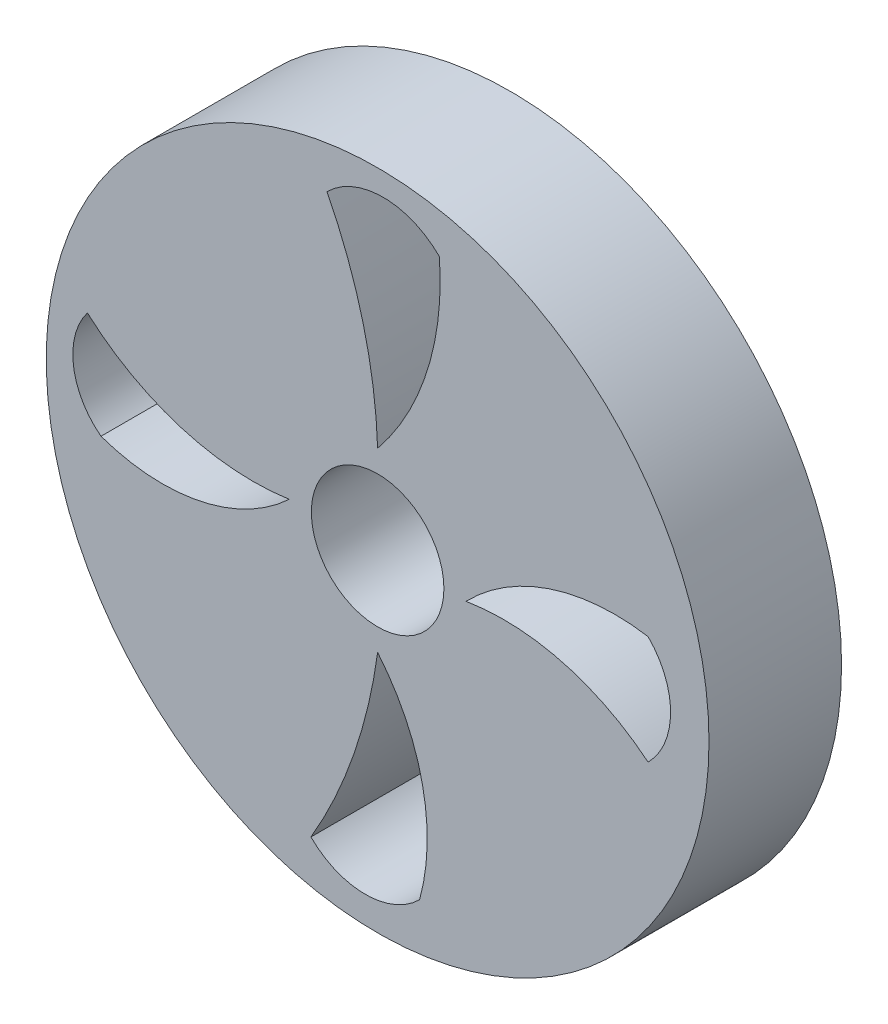
ISO-10303-21;
HEADER;
FILE_DESCRIPTION(('STEP AP214'),'2;1');
FILE_NAME('part.step','',(''),(''),'','','');
FILE_SCHEMA(('AUTOMOTIVE_DESIGN { 1 0 10303 214 1 1 1 1 }'));
ENDSEC;
DATA;
#1=APPLICATION_CONTEXT('core data for automotive mechanical design processes');
#2=APPLICATION_PROTOCOL_DEFINITION('international standard','automotive_design',2000,#1);
#3=PRODUCT_CONTEXT('',#1,'mechanical');
#4=PRODUCT('Part','Part','',(#3));
#5=PRODUCT_RELATED_PRODUCT_CATEGORY('part','',(#4));
#6=PRODUCT_DEFINITION_FORMATION('','',#4);
#7=PRODUCT_DEFINITION_CONTEXT('part definition',#1,'design');
#8=PRODUCT_DEFINITION('design','',#6,#7);
#9=PRODUCT_DEFINITION_SHAPE('','',#8);
#10=(LENGTH_UNIT() NAMED_UNIT(*) SI_UNIT(.MILLI.,.METRE.));
#11=(NAMED_UNIT(*) PLANE_ANGLE_UNIT() SI_UNIT($,.RADIAN.));
#12=(NAMED_UNIT(*) SI_UNIT($,.STERADIAN.) SOLID_ANGLE_UNIT());
#13=UNCERTAINTY_MEASURE_WITH_UNIT(LENGTH_MEASURE(1.E-05),#10,'distance_accuracy_value','');
#14=(GEOMETRIC_REPRESENTATION_CONTEXT(3) GLOBAL_UNCERTAINTY_ASSIGNED_CONTEXT((#13)) GLOBAL_UNIT_ASSIGNED_CONTEXT((#10,
#11,#12)) REPRESENTATION_CONTEXT('',''));
#15=CARTESIAN_POINT('',(0.,0.,0.));
#16=DIRECTION('',(0.,0.,1.));
#17=DIRECTION('',(1.,0.,0.));
#18=AXIS2_PLACEMENT_3D('',#15,#16,#17);
#19=CARTESIAN_POINT('',(0.,0.,30.));
#20=DIRECTION('',(0.,0.,1.));
#21=DIRECTION('',(1.,0.,0.));
#22=AXIS2_PLACEMENT_3D('',#19,#20,#21);
#23=PLANE('',#22);
#24=CARTESIAN_POINT('',(-106.126669455421,16.4687254610501,30.));
#25=DIRECTION('',(0.,0.,-1.));
#26=DIRECTION('',(1.,0.,0.));
#27=AXIS2_PLACEMENT_3D('',#24,#25,#26);
#28=CIRCLE('',#27,106.185403279215);
#29=CARTESIAN_POINT('',(-11.4602468320541,64.5687077610854,30.));
#30=VERTEX_POINT('',#29);
#31=CARTESIAN_POINT('',(0.,20.,30.));
#32=VERTEX_POINT('',#31);
#33=EDGE_CURVE('E51',#30,#32,#28,.T.);
#34=ORIENTED_EDGE('',*,*,#33,.F.);
#35=CARTESIAN_POINT('',(1.25783196937179,51.8506289596594,30.));
#36=DIRECTION('',(0.,0.,1.));
#37=DIRECTION('',(-1.,0.,0.));
#38=AXIS2_PLACEMENT_3D('',#35,#36,#37);
#39=CIRCLE('',#38,17.9860795283063);
#40=CARTESIAN_POINT('',(13.9759107707977,64.5687077610854,30.));
#41=VERTEX_POINT('',#40);
#42=EDGE_CURVE('E143',#41,#30,#39,.T.);
#43=ORIENTED_EDGE('',*,*,#42,.F.);
#44=CARTESIAN_POINT('',(-48.9227364039404,59.8168980990145,30.));
#45=DIRECTION('',(0.,0.,1.));
#46=DIRECTION('',(1.,0.,0.));
#47=AXIS2_PLACEMENT_3D('',#44,#45,#46);
#48=CIRCLE('',#47,63.0778844879625);
#49=EDGE_CURVE('E146',#32,#41,#48,.T.);
#50=ORIENTED_EDGE('',*,*,#49,.F.);
#51=EDGE_LOOP('',(#34,#43,#50));
#52=FACE_BOUND('',#51,.T.);
#53=CARTESIAN_POINT('',(-28.187497756684,55.7355617112716,30.));
#54=DIRECTION('',(0.,0.,-1.));
#55=DIRECTION('',(-1.,0.,0.));
#56=AXIS2_PLACEMENT_3D('',#53,#54,#55);
#57=CIRCLE('',#56,56.3337195539818);
#58=CARTESIAN_POINT('',(-20.,0.,30.));
#59=VERTEX_POINT('',#58);
#60=CARTESIAN_POINT('',(-65.6867806227491,13.6963925553818,30.));
#61=VERTEX_POINT('',#60);
#62=EDGE_CURVE('E59',#59,#61,#57,.T.);
#63=ORIENTED_EDGE('',*,*,#62,.F.);
#64=CARTESIAN_POINT('',(-48.6879422626072,30.6951624182342,30.));
#65=DIRECTION('',(0.,0.,1.));
#66=DIRECTION('',(-1.,0.,0.));
#67=AXIS2_PLACEMENT_3D('',#64,#65,#66);
#68=CIRCLE('',#67,42.0141765020387);
#69=CARTESIAN_POINT('',(-62.6120802531736,-8.94458289331041,30.));
#70=VERTEX_POINT('',#69);
#71=EDGE_CURVE('E164',#70,#59,#68,.T.);
#72=ORIENTED_EDGE('',*,*,#71,.F.);
#73=CARTESIAN_POINT('',(-52.8289427136153,3.91325501582344,30.));
#74=DIRECTION('',(0.,0.,1.));
#75=DIRECTION('',(1.,0.,0.));
#76=AXIS2_PLACEMENT_3D('',#73,#74,#75);
#77=CIRCLE('',#76,16.1565397228328);
#78=EDGE_CURVE('E167',#61,#70,#77,.T.);
#79=ORIENTED_EDGE('',*,*,#78,.F.);
#80=EDGE_LOOP('',(#63,#72,#79));
#81=FACE_BOUND('',#80,.T.);
#82=CARTESIAN_POINT('',(53.7070275288195,-32.5710055331906,30.));
#83=DIRECTION('',(0.,0.,1.));
#84=DIRECTION('',(-1.,0.,0.));
#85=AXIS2_PLACEMENT_3D('',#82,#83,#84);
#86=CIRCLE('',#85,46.8725304018434);
#87=CARTESIAN_POINT('',(61.2144891760938,13.6963925553818,30.));
#88=VERTEX_POINT('',#87);
#89=CARTESIAN_POINT('',(20.,0.,30.));
#90=VERTEX_POINT('',#89);
#91=EDGE_CURVE('E163',#88,#90,#86,.T.);
#92=ORIENTED_EDGE('',*,*,#91,.F.);
#93=CARTESIAN_POINT('',(48.9156876977919,1.39759107707988,30.));
#94=DIRECTION('',(0.,0.,1.));
#95=DIRECTION('',(-1.,0.,0.));
#96=AXIS2_PLACEMENT_3D('',#93,#94,#95);
#97=CIRCLE('',#96,17.3931318515489);
#98=CARTESIAN_POINT('',(61.2144891760938,-10.9012104012221,30.));
#99=VERTEX_POINT('',#98);
#100=EDGE_CURVE('E188',#99,#88,#97,.T.);
#101=ORIENTED_EDGE('',*,*,#100,.F.);
#102=CARTESIAN_POINT('',(28.5654745935392,-50.9772376417217,30.));
#103=DIRECTION('',(0.,0.,-1.));
#104=DIRECTION('',(-1.,0.,0.));
#105=AXIS2_PLACEMENT_3D('',#102,#103,#104);
#106=CIRCLE('',#105,51.6918379688044);
#107=EDGE_CURVE('E191',#90,#99,#106,.T.);
#108=ORIENTED_EDGE('',*,*,#107,.F.);
#109=EDGE_LOOP('',(#92,#101,#108));
#110=FACE_BOUND('',#109,.T.);
#111=CARTESIAN_POINT('',(-116.539732142312,-4.24493298694466,30.));
#112=DIRECTION('',(0.,0.,-1.));
#113=DIRECTION('',(-1.,0.,0.));
#114=AXIS2_PLACEMENT_3D('',#111,#112,#113);
#115=CIRCLE('',#114,117.599877994782);
#116=CARTESIAN_POINT('',(0.,-20.,30.));
#117=VERTEX_POINT('',#116);
#118=CARTESIAN_POINT('',(-15.0939836324615,-63.7301531148373,30.));
#119=VERTEX_POINT('',#118);
#120=EDGE_CURVE('E187',#117,#119,#115,.T.);
#121=ORIENTED_EDGE('',*,*,#120,.F.);
#122=CARTESIAN_POINT('',(-37.074652396603,-50.9549777987307,30.));
#123=DIRECTION('',(0.,0.,1.));
#124=DIRECTION('',(-1.,0.,0.));
#125=AXIS2_PLACEMENT_3D('',#122,#123,#124);
#126=CIRCLE('',#125,48.2984523649449);
#127=CARTESIAN_POINT('',(9.50361932414243,-63.7301531148373,30.));
#128=VERTEX_POINT('',#127);
#129=EDGE_CURVE('E211',#128,#117,#126,.T.);
#130=ORIENTED_EDGE('',*,*,#129,.F.);
#131=CARTESIAN_POINT('',(-2.79518215415954,-51.4313516365353,30.));
#132=DIRECTION('',(0.,0.,1.));
#133=DIRECTION('',(1.,0.,0.));
#134=AXIS2_PLACEMENT_3D('',#131,#132,#133);
#135=CIRCLE('',#134,17.3931318515489);
#136=EDGE_CURVE('E214',#119,#128,#135,.T.);
#137=ORIENTED_EDGE('',*,*,#136,.F.);
#138=EDGE_LOOP('',(#121,#130,#137));
#139=FACE_BOUND('',#138,.T.);
#140=CARTESIAN_POINT('',(0.,0.,30.));
#141=DIRECTION('',(0.,0.,1.));
#142=DIRECTION('',(1.,0.,0.));
#143=AXIS2_PLACEMENT_3D('',#140,#141,#142);
#144=CIRCLE('',#143,75.);
#145=CARTESIAN_POINT('',(75.,0.,30.));
#146=VERTEX_POINT('',#145);
#147=EDGE_CURVE('E11',#146,#146,#144,.T.);
#148=ORIENTED_EDGE('',*,*,#147,.T.);
#149=EDGE_LOOP('',(#148));
#150=FACE_BOUND('',#149,.T.);
#151=CARTESIAN_POINT('',(0.,0.,30.));
#152=DIRECTION('',(0.,0.,1.));
#153=DIRECTION('',(1.,0.,0.));
#154=AXIS2_PLACEMENT_3D('',#151,#152,#153);
#155=CIRCLE('',#154,15.);
#156=CARTESIAN_POINT('',(15.,0.,30.));
#157=VERTEX_POINT('',#156);
#158=EDGE_CURVE('E226',#157,#157,#155,.T.);
#159=ORIENTED_EDGE('',*,*,#158,.F.);
#160=EDGE_LOOP('',(#159));
#161=FACE_BOUND('',#160,.T.);
#162=ADVANCED_FACE('F36',(#52,#81,#110,#139,#150,#161),#23,.T.);
#163=CARTESIAN_POINT('',(0.,0.,0.));
#164=DIRECTION('',(0.,0.,1.));
#165=DIRECTION('',(1.,0.,0.));
#166=AXIS2_PLACEMENT_3D('',#163,#164,#165);
#167=PLANE('',#166);
#168=CARTESIAN_POINT('',(1.25783196937179,51.8506289596594,0.));
#169=DIRECTION('',(0.,0.,1.));
#170=DIRECTION('',(-1.,0.,0.));
#171=AXIS2_PLACEMENT_3D('',#168,#169,#170);
#172=CIRCLE('',#171,17.9860795283063);
#173=CARTESIAN_POINT('',(13.9759107707977,64.5687077610854,0.));
#174=VERTEX_POINT('',#173);
#175=CARTESIAN_POINT('',(-11.4602468320541,64.5687077610854,0.));
#176=VERTEX_POINT('',#175);
#177=EDGE_CURVE('E133',#174,#176,#172,.T.);
#178=ORIENTED_EDGE('',*,*,#177,.T.);
#179=CARTESIAN_POINT('',(-106.126669455421,16.4687254610501,0.));
#180=DIRECTION('',(0.,0.,-1.));
#181=DIRECTION('',(1.,0.,0.));
#182=AXIS2_PLACEMENT_3D('',#179,#180,#181);
#183=CIRCLE('',#182,106.185403279215);
#184=CARTESIAN_POINT('',(0.,20.,0.));
#185=VERTEX_POINT('',#184);
#186=EDGE_CURVE('E127',#176,#185,#183,.T.);
#187=ORIENTED_EDGE('',*,*,#186,.T.);
#188=CARTESIAN_POINT('',(-48.9227364039404,59.8168980990145,0.));
#189=DIRECTION('',(0.,0.,1.));
#190=DIRECTION('',(1.,0.,0.));
#191=AXIS2_PLACEMENT_3D('',#188,#189,#190);
#192=CIRCLE('',#191,63.0778844879625);
#193=EDGE_CURVE('E137',#185,#174,#192,.T.);
#194=ORIENTED_EDGE('',*,*,#193,.T.);
#195=EDGE_LOOP('',(#178,#187,#194));
#196=FACE_BOUND('',#195,.T.);
#197=CARTESIAN_POINT('',(-48.6879422626072,30.6951624182342,0.));
#198=DIRECTION('',(0.,0.,1.));
#199=DIRECTION('',(-1.,0.,0.));
#200=AXIS2_PLACEMENT_3D('',#197,#198,#199);
#201=CIRCLE('',#200,42.0141765020387);
#202=CARTESIAN_POINT('',(-62.6120802531736,-8.94458289331042,0.));
#203=VERTEX_POINT('',#202);
#204=CARTESIAN_POINT('',(-20.,0.,0.));
#205=VERTEX_POINT('',#204);
#206=EDGE_CURVE('E158',#203,#205,#201,.T.);
#207=ORIENTED_EDGE('',*,*,#206,.T.);
#208=CARTESIAN_POINT('',(-28.187497756684,55.7355617112716,0.));
#209=DIRECTION('',(0.,0.,-1.));
#210=DIRECTION('',(-1.,0.,0.));
#211=AXIS2_PLACEMENT_3D('',#208,#209,#210);
#212=CIRCLE('',#211,56.3337195539818);
#213=CARTESIAN_POINT('',(-65.6867806227491,13.6963925553818,0.));
#214=VERTEX_POINT('',#213);
#215=EDGE_CURVE('E168',#205,#214,#212,.T.);
#216=ORIENTED_EDGE('',*,*,#215,.T.);
#217=CARTESIAN_POINT('',(-52.8289427136153,3.91325501582344,0.));
#218=DIRECTION('',(0.,0.,1.));
#219=DIRECTION('',(1.,0.,0.));
#220=AXIS2_PLACEMENT_3D('',#217,#218,#219);
#221=CIRCLE('',#220,16.1565397228328);
#222=EDGE_CURVE('E174',#214,#203,#221,.T.);
#223=ORIENTED_EDGE('',*,*,#222,.T.);
#224=EDGE_LOOP('',(#207,#216,#223));
#225=FACE_BOUND('',#224,.T.);
#226=CARTESIAN_POINT('',(48.9156876977919,1.39759107707988,0.));
#227=DIRECTION('',(0.,0.,1.));
#228=DIRECTION('',(-1.,0.,0.));
#229=AXIS2_PLACEMENT_3D('',#226,#227,#228);
#230=CIRCLE('',#229,17.3931318515489);
#231=CARTESIAN_POINT('',(61.2144891760938,-10.9012104012221,0.));
#232=VERTEX_POINT('',#231);
#233=CARTESIAN_POINT('',(61.2144891760938,13.6963925553818,0.));
#234=VERTEX_POINT('',#233);
#235=EDGE_CURVE('E182',#232,#234,#230,.T.);
#236=ORIENTED_EDGE('',*,*,#235,.T.);
#237=CARTESIAN_POINT('',(53.7070275288195,-32.5710055331906,0.));
#238=DIRECTION('',(0.,0.,1.));
#239=DIRECTION('',(-1.,0.,0.));
#240=AXIS2_PLACEMENT_3D('',#237,#238,#239);
#241=CIRCLE('',#240,46.8725304018434);
#242=CARTESIAN_POINT('',(20.,0.,0.));
#243=VERTEX_POINT('',#242);
#244=EDGE_CURVE('E192',#234,#243,#241,.T.);
#245=ORIENTED_EDGE('',*,*,#244,.T.);
#246=CARTESIAN_POINT('',(28.5654745935392,-50.9772376417217,0.));
#247=DIRECTION('',(0.,0.,-1.));
#248=DIRECTION('',(-1.,0.,0.));
#249=AXIS2_PLACEMENT_3D('',#246,#247,#248);
#250=CIRCLE('',#249,51.6918379688044);
#251=EDGE_CURVE('E198',#243,#232,#250,.T.);
#252=ORIENTED_EDGE('',*,*,#251,.T.);
#253=EDGE_LOOP('',(#236,#245,#252));
#254=FACE_BOUND('',#253,.T.);
#255=CARTESIAN_POINT('',(-37.074652396603,-50.9549777987307,0.));
#256=DIRECTION('',(0.,0.,1.));
#257=DIRECTION('',(-1.,0.,0.));
#258=AXIS2_PLACEMENT_3D('',#255,#256,#257);
#259=CIRCLE('',#258,48.2984523649449);
#260=CARTESIAN_POINT('',(9.50361932414243,-63.7301531148373,0.));
#261=VERTEX_POINT('',#260);
#262=CARTESIAN_POINT('',(0.,-20.,0.));
#263=VERTEX_POINT('',#262);
#264=EDGE_CURVE('E206',#261,#263,#259,.T.);
#265=ORIENTED_EDGE('',*,*,#264,.T.);
#266=CARTESIAN_POINT('',(-116.539732142312,-4.24493298694466,0.));
#267=DIRECTION('',(0.,0.,-1.));
#268=DIRECTION('',(-1.,0.,0.));
#269=AXIS2_PLACEMENT_3D('',#266,#267,#268);
#270=CIRCLE('',#269,117.599877994782);
#271=CARTESIAN_POINT('',(-15.0939836324615,-63.7301531148373,0.));
#272=VERTEX_POINT('',#271);
#273=EDGE_CURVE('E215',#263,#272,#270,.T.);
#274=ORIENTED_EDGE('',*,*,#273,.T.);
#275=CARTESIAN_POINT('',(-2.79518215415954,-51.4313516365353,0.));
#276=DIRECTION('',(0.,0.,1.));
#277=DIRECTION('',(1.,0.,0.));
#278=AXIS2_PLACEMENT_3D('',#275,#276,#277);
#279=CIRCLE('',#278,17.3931318515489);
#280=EDGE_CURVE('E221',#272,#261,#279,.T.);
#281=ORIENTED_EDGE('',*,*,#280,.T.);
#282=EDGE_LOOP('',(#265,#274,#281));
#283=FACE_BOUND('',#282,.T.);
#284=CARTESIAN_POINT('',(0.,0.,0.));
#285=DIRECTION('',(0.,0.,1.));
#286=DIRECTION('',(1.,0.,0.));
#287=AXIS2_PLACEMENT_3D('',#284,#285,#286);
#288=CIRCLE('',#287,75.);
#289=CARTESIAN_POINT('',(75.,0.,0.));
#290=VERTEX_POINT('',#289);
#291=EDGE_CURVE('E40',#290,#290,#288,.T.);
#292=ORIENTED_EDGE('',*,*,#291,.F.);
#293=EDGE_LOOP('',(#292));
#294=FACE_BOUND('',#293,.T.);
#295=CARTESIAN_POINT('',(0.,0.,0.));
#296=DIRECTION('',(0.,0.,1.));
#297=DIRECTION('',(1.,0.,0.));
#298=AXIS2_PLACEMENT_3D('',#295,#296,#297);
#299=CIRCLE('',#298,15.);
#300=CARTESIAN_POINT('',(15.,0.,0.));
#301=VERTEX_POINT('',#300);
#302=EDGE_CURVE('E154',#301,#301,#299,.T.);
#303=ORIENTED_EDGE('',*,*,#302,.T.);
#304=EDGE_LOOP('',(#303));
#305=FACE_BOUND('',#304,.T.);
#306=ADVANCED_FACE('F141',(#196,#225,#254,#283,#294,#305),#167,.F.);
#307=CARTESIAN_POINT('',(0.,0.,30.));
#308=DIRECTION('',(0.,0.,-1.));
#309=DIRECTION('',(-1.,0.,0.));
#310=AXIS2_PLACEMENT_3D('',#307,#308,#309);
#311=CYLINDRICAL_SURFACE('',#310,75.);
#312=ORIENTED_EDGE('',*,*,#147,.F.);
#313=EDGE_LOOP('',(#312));
#314=FACE_BOUND('',#313,.T.);
#315=ORIENTED_EDGE('',*,*,#291,.T.);
#316=EDGE_LOOP('',(#315));
#317=FACE_BOUND('',#316,.T.);
#318=ADVANCED_FACE('F38',(#314,#317),#311,.T.);
#319=CARTESIAN_POINT('',(0.,0.,30.));
#320=DIRECTION('',(0.,0.,-1.));
#321=DIRECTION('',(-1.,0.,0.));
#322=AXIS2_PLACEMENT_3D('',#319,#320,#321);
#323=CYLINDRICAL_SURFACE('',#322,15.);
#324=ORIENTED_EDGE('',*,*,#158,.T.);
#325=EDGE_LOOP('',(#324));
#326=FACE_BOUND('',#325,.T.);
#327=ORIENTED_EDGE('',*,*,#302,.F.);
#328=EDGE_LOOP('',(#327));
#329=FACE_BOUND('',#328,.T.);
#330=ADVANCED_FACE('F233',(#326,#329),#323,.F.);
#331=CARTESIAN_POINT('',(-116.539732142312,-4.24493298694466,0.));
#332=DIRECTION('',(0.,0.,1.));
#333=DIRECTION('',(1.,0.,0.));
#334=AXIS2_PLACEMENT_3D('',#331,#332,#333);
#335=CYLINDRICAL_SURFACE('',#334,117.599877994782);
#336=ORIENTED_EDGE('',*,*,#120,.T.);
#337=DIRECTION('',(0.,0.,1.));
#338=VECTOR('',#337,1.);
#339=CARTESIAN_POINT('',(-15.0939836324615,-63.7301531148373,0.));
#340=LINE('',#339,#338);
#341=EDGE_CURVE('E203',#272,#119,#340,.T.);
#342=ORIENTED_EDGE('',*,*,#341,.F.);
#343=ORIENTED_EDGE('',*,*,#273,.F.);
#344=DIRECTION('',(0.,0.,1.));
#345=VECTOR('',#344,1.);
#346=CARTESIAN_POINT('',(0.,-20.,0.));
#347=LINE('',#346,#345);
#348=EDGE_CURVE('E209',#263,#117,#347,.T.);
#349=ORIENTED_EDGE('',*,*,#348,.T.);
#350=EDGE_LOOP('',(#336,#342,#343,#349));
#351=FACE_BOUND('',#350,.T.);
#352=ADVANCED_FACE('F235',(#351),#335,.T.);
#353=CARTESIAN_POINT('',(-37.074652396603,-50.9549777987307,0.));
#354=DIRECTION('',(0.,0.,1.));
#355=DIRECTION('',(1.,0.,0.));
#356=AXIS2_PLACEMENT_3D('',#353,#354,#355);
#357=CYLINDRICAL_SURFACE('',#356,48.2984523649449);
#358=ORIENTED_EDGE('',*,*,#129,.T.);
#359=ORIENTED_EDGE('',*,*,#348,.F.);
#360=ORIENTED_EDGE('',*,*,#264,.F.);
#361=DIRECTION('',(0.,0.,1.));
#362=VECTOR('',#361,1.);
#363=CARTESIAN_POINT('',(9.50361932414243,-63.7301531148373,0.));
#364=LINE('',#363,#362);
#365=EDGE_CURVE('E207',#261,#128,#364,.T.);
#366=ORIENTED_EDGE('',*,*,#365,.T.);
#367=EDGE_LOOP('',(#358,#359,#360,#366));
#368=FACE_BOUND('',#367,.T.);
#369=ADVANCED_FACE('F242',(#368),#357,.F.);
#370=CARTESIAN_POINT('',(-2.79518215415954,-51.4313516365353,0.));
#371=DIRECTION('',(0.,0.,1.));
#372=DIRECTION('',(1.,0.,0.));
#373=AXIS2_PLACEMENT_3D('',#370,#371,#372);
#374=CYLINDRICAL_SURFACE('',#373,17.3931318515489);
#375=ORIENTED_EDGE('',*,*,#136,.T.);
#376=ORIENTED_EDGE('',*,*,#365,.F.);
#377=ORIENTED_EDGE('',*,*,#280,.F.);
#378=ORIENTED_EDGE('',*,*,#341,.T.);
#379=EDGE_LOOP('',(#375,#376,#377,#378));
#380=FACE_BOUND('',#379,.T.);
#381=ADVANCED_FACE('F276',(#380),#374,.F.);
#382=CARTESIAN_POINT('',(53.7070275288195,-32.5710055331906,0.));
#383=DIRECTION('',(0.,0.,1.));
#384=DIRECTION('',(1.,0.,0.));
#385=AXIS2_PLACEMENT_3D('',#382,#383,#384);
#386=CYLINDRICAL_SURFACE('',#385,46.8725304018434);
#387=ORIENTED_EDGE('',*,*,#91,.T.);
#388=DIRECTION('',(0.,0.,1.));
#389=VECTOR('',#388,1.);
#390=CARTESIAN_POINT('',(20.,0.,0.));
#391=LINE('',#390,#389);
#392=EDGE_CURVE('E179',#243,#90,#391,.T.);
#393=ORIENTED_EDGE('',*,*,#392,.F.);
#394=ORIENTED_EDGE('',*,*,#244,.F.);
#395=DIRECTION('',(0.,0.,1.));
#396=VECTOR('',#395,1.);
#397=CARTESIAN_POINT('',(61.2144891760938,13.6963925553818,0.));
#398=LINE('',#397,#396);
#399=EDGE_CURVE('E185',#234,#88,#398,.T.);
#400=ORIENTED_EDGE('',*,*,#399,.T.);
#401=EDGE_LOOP('',(#387,#393,#394,#400));
#402=FACE_BOUND('',#401,.T.);
#403=ADVANCED_FACE('F284',(#402),#386,.F.);
#404=CARTESIAN_POINT('',(48.9156876977919,1.39759107707988,0.));
#405=DIRECTION('',(0.,0.,1.));
#406=DIRECTION('',(1.,0.,0.));
#407=AXIS2_PLACEMENT_3D('',#404,#405,#406);
#408=CYLINDRICAL_SURFACE('',#407,17.3931318515489);
#409=ORIENTED_EDGE('',*,*,#100,.T.);
#410=ORIENTED_EDGE('',*,*,#399,.F.);
#411=ORIENTED_EDGE('',*,*,#235,.F.);
#412=DIRECTION('',(0.,0.,1.));
#413=VECTOR('',#412,1.);
#414=CARTESIAN_POINT('',(61.2144891760938,-10.9012104012221,0.));
#415=LINE('',#414,#413);
#416=EDGE_CURVE('E183',#232,#99,#415,.T.);
#417=ORIENTED_EDGE('',*,*,#416,.T.);
#418=EDGE_LOOP('',(#409,#410,#411,#417));
#419=FACE_BOUND('',#418,.T.);
#420=ADVANCED_FACE('F287',(#419),#408,.F.);
#421=CARTESIAN_POINT('',(28.5654745935392,-50.9772376417217,0.));
#422=DIRECTION('',(0.,0.,1.));
#423=DIRECTION('',(1.,0.,0.));
#424=AXIS2_PLACEMENT_3D('',#421,#422,#423);
#425=CYLINDRICAL_SURFACE('',#424,51.6918379688044);
#426=ORIENTED_EDGE('',*,*,#107,.T.);
#427=ORIENTED_EDGE('',*,*,#416,.F.);
#428=ORIENTED_EDGE('',*,*,#251,.F.);
#429=ORIENTED_EDGE('',*,*,#392,.T.);
#430=EDGE_LOOP('',(#426,#427,#428,#429));
#431=FACE_BOUND('',#430,.T.);
#432=ADVANCED_FACE('F290',(#431),#425,.T.);
#433=CARTESIAN_POINT('',(-28.187497756684,55.7355617112716,0.));
#434=DIRECTION('',(0.,0.,1.));
#435=DIRECTION('',(1.,0.,0.));
#436=AXIS2_PLACEMENT_3D('',#433,#434,#435);
#437=CYLINDRICAL_SURFACE('',#436,56.3337195539818);
#438=ORIENTED_EDGE('',*,*,#62,.T.);
#439=DIRECTION('',(0.,0.,1.));
#440=VECTOR('',#439,1.);
#441=CARTESIAN_POINT('',(-65.6867806227491,13.6963925553818,0.));
#442=LINE('',#441,#440);
#443=EDGE_CURVE('E156',#214,#61,#442,.T.);
#444=ORIENTED_EDGE('',*,*,#443,.F.);
#445=ORIENTED_EDGE('',*,*,#215,.F.);
#446=DIRECTION('',(0.,0.,1.));
#447=VECTOR('',#446,1.);
#448=CARTESIAN_POINT('',(-20.,0.,0.));
#449=LINE('',#448,#447);
#450=EDGE_CURVE('E161',#205,#59,#449,.T.);
#451=ORIENTED_EDGE('',*,*,#450,.T.);
#452=EDGE_LOOP('',(#438,#444,#445,#451));
#453=FACE_BOUND('',#452,.T.);
#454=ADVANCED_FACE('F294',(#453),#437,.T.);
#455=CARTESIAN_POINT('',(-48.6879422626072,30.6951624182342,0.));
#456=DIRECTION('',(0.,0.,1.));
#457=DIRECTION('',(1.,0.,0.));
#458=AXIS2_PLACEMENT_3D('',#455,#456,#457);
#459=CYLINDRICAL_SURFACE('',#458,42.0141765020387);
#460=ORIENTED_EDGE('',*,*,#71,.T.);
#461=ORIENTED_EDGE('',*,*,#450,.F.);
#462=ORIENTED_EDGE('',*,*,#206,.F.);
#463=DIRECTION('',(0.,0.,1.));
#464=VECTOR('',#463,1.);
#465=CARTESIAN_POINT('',(-62.6120802531736,-8.94458289331041,0.));
#466=LINE('',#465,#464);
#467=EDGE_CURVE('E159',#203,#70,#466,.T.);
#468=ORIENTED_EDGE('',*,*,#467,.T.);
#469=EDGE_LOOP('',(#460,#461,#462,#468));
#470=FACE_BOUND('',#469,.T.);
#471=ADVANCED_FACE('F299',(#470),#459,.F.);
#472=CARTESIAN_POINT('',(-52.8289427136153,3.91325501582344,0.));
#473=DIRECTION('',(0.,0.,1.));
#474=DIRECTION('',(1.,0.,0.));
#475=AXIS2_PLACEMENT_3D('',#472,#473,#474);
#476=CYLINDRICAL_SURFACE('',#475,16.1565397228328);
#477=ORIENTED_EDGE('',*,*,#78,.T.);
#478=ORIENTED_EDGE('',*,*,#467,.F.);
#479=ORIENTED_EDGE('',*,*,#222,.F.);
#480=ORIENTED_EDGE('',*,*,#443,.T.);
#481=EDGE_LOOP('',(#477,#478,#479,#480));
#482=FACE_BOUND('',#481,.T.);
#483=ADVANCED_FACE('F302',(#482),#476,.F.);
#484=CARTESIAN_POINT('',(-106.126669455421,16.4687254610501,0.));
#485=DIRECTION('',(0.,0.,1.));
#486=DIRECTION('',(1.,0.,0.));
#487=AXIS2_PLACEMENT_3D('',#484,#485,#486);
#488=CYLINDRICAL_SURFACE('',#487,106.185403279215);
#489=ORIENTED_EDGE('',*,*,#33,.T.);
#490=DIRECTION('',(0.,0.,1.));
#491=VECTOR('',#490,1.);
#492=CARTESIAN_POINT('',(0.,20.,0.));
#493=LINE('',#492,#491);
#494=EDGE_CURVE('E123',#185,#32,#493,.T.);
#495=ORIENTED_EDGE('',*,*,#494,.F.);
#496=ORIENTED_EDGE('',*,*,#186,.F.);
#497=DIRECTION('',(0.,0.,1.));
#498=VECTOR('',#497,1.);
#499=CARTESIAN_POINT('',(-11.4602468320541,64.5687077610854,0.));
#500=LINE('',#499,#498);
#501=EDGE_CURVE('E152',#176,#30,#500,.T.);
#502=ORIENTED_EDGE('',*,*,#501,.T.);
#503=EDGE_LOOP('',(#489,#495,#496,#502));
#504=FACE_BOUND('',#503,.T.);
#505=ADVANCED_FACE('F125',(#504),#488,.T.);
#506=CARTESIAN_POINT('',(1.25783196937179,51.8506289596594,0.));
#507=DIRECTION('',(0.,0.,1.));
#508=DIRECTION('',(1.,0.,0.));
#509=AXIS2_PLACEMENT_3D('',#506,#507,#508);
#510=CYLINDRICAL_SURFACE('',#509,17.9860795283063);
#511=ORIENTED_EDGE('',*,*,#42,.T.);
#512=ORIENTED_EDGE('',*,*,#501,.F.);
#513=ORIENTED_EDGE('',*,*,#177,.F.);
#514=DIRECTION('',(0.,0.,1.));
#515=VECTOR('',#514,1.);
#516=CARTESIAN_POINT('',(13.9759107707977,64.5687077610854,0.));
#517=LINE('',#516,#515);
#518=EDGE_CURVE('E132',#174,#41,#517,.T.);
#519=ORIENTED_EDGE('',*,*,#518,.T.);
#520=EDGE_LOOP('',(#511,#512,#513,#519));
#521=FACE_BOUND('',#520,.T.);
#522=ADVANCED_FACE('F311',(#521),#510,.F.);
#523=CARTESIAN_POINT('',(-48.9227364039404,59.8168980990145,0.));
#524=DIRECTION('',(0.,0.,1.));
#525=DIRECTION('',(1.,0.,0.));
#526=AXIS2_PLACEMENT_3D('',#523,#524,#525);
#527=CYLINDRICAL_SURFACE('',#526,63.0778844879625);
#528=ORIENTED_EDGE('',*,*,#49,.T.);
#529=ORIENTED_EDGE('',*,*,#518,.F.);
#530=ORIENTED_EDGE('',*,*,#193,.F.);
#531=ORIENTED_EDGE('',*,*,#494,.T.);
#532=EDGE_LOOP('',(#528,#529,#530,#531));
#533=FACE_BOUND('',#532,.T.);
#534=ADVANCED_FACE('F138',(#533),#527,.F.);
#535=CLOSED_SHELL('',(#162,#306,#318,#330,#352,#369,#381,#403,#420,#432,#454,#471,#483,#505,
#522,#534));
#536=MANIFOLD_SOLID_BREP('B2',#535);
#537=ADVANCED_BREP_SHAPE_REPRESENTATION('',(#18,#536),#14);
#538=SHAPE_DEFINITION_REPRESENTATION(#9,#537);
ENDSEC;
END-ISO-10303-21;
